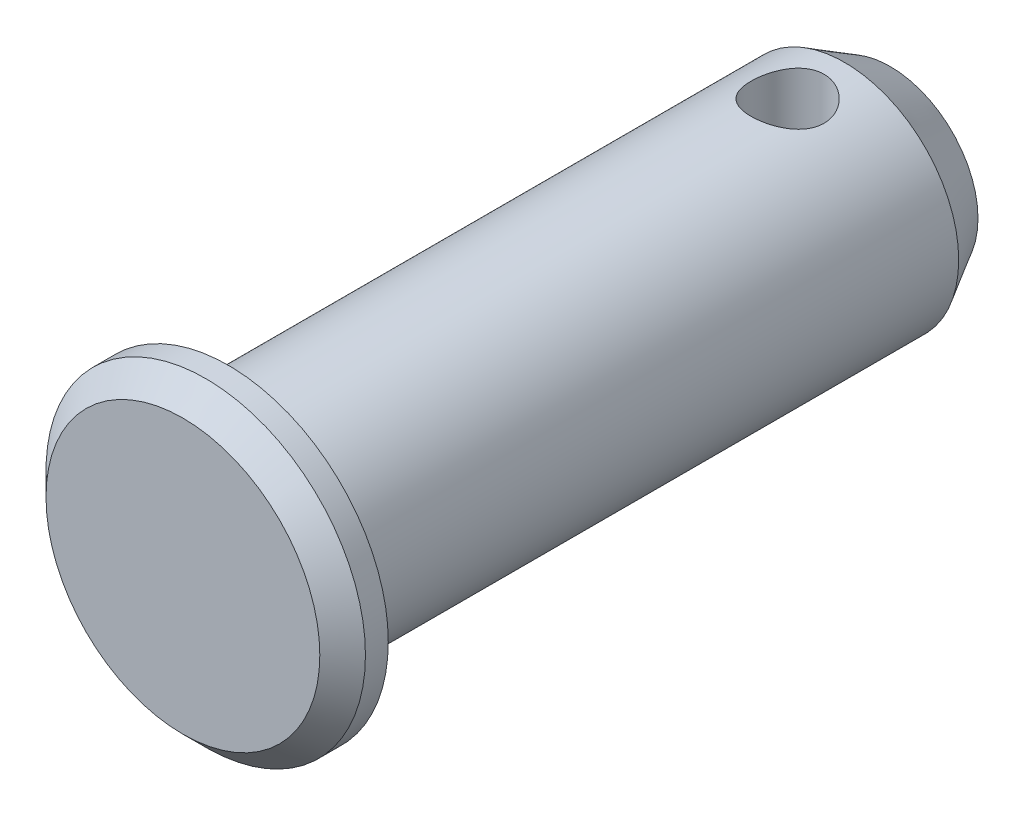
ISO-10303-21;
HEADER;
FILE_DESCRIPTION(('STEP AP214'),'2;1');
FILE_NAME('part.step','',(''),(''),'','','');
FILE_SCHEMA(('AUTOMOTIVE_DESIGN { 1 0 10303 214 1 1 1 1 }'));
ENDSEC;
DATA;
#1=APPLICATION_CONTEXT('core data for automotive mechanical design processes');
#2=APPLICATION_PROTOCOL_DEFINITION('international standard','automotive_design',2000,#1);
#3=PRODUCT_CONTEXT('',#1,'mechanical');
#4=PRODUCT('Part','Part','',(#3));
#5=PRODUCT_RELATED_PRODUCT_CATEGORY('part','',(#4));
#6=PRODUCT_DEFINITION_FORMATION('','',#4);
#7=PRODUCT_DEFINITION_CONTEXT('part definition',#1,'design');
#8=PRODUCT_DEFINITION('design','',#6,#7);
#9=PRODUCT_DEFINITION_SHAPE('','',#8);
#10=(LENGTH_UNIT() NAMED_UNIT(*) SI_UNIT(.MILLI.,.METRE.));
#11=(NAMED_UNIT(*) PLANE_ANGLE_UNIT() SI_UNIT($,.RADIAN.));
#12=(NAMED_UNIT(*) SI_UNIT($,.STERADIAN.) SOLID_ANGLE_UNIT());
#13=UNCERTAINTY_MEASURE_WITH_UNIT(LENGTH_MEASURE(1.E-05),#10,'distance_accuracy_value','');
#14=(GEOMETRIC_REPRESENTATION_CONTEXT(3) GLOBAL_UNCERTAINTY_ASSIGNED_CONTEXT((#13)) GLOBAL_UNIT_ASSIGNED_CONTEXT((#10,
#11,#12)) REPRESENTATION_CONTEXT('',''));
#15=CARTESIAN_POINT('',(0.,0.,0.));
#16=DIRECTION('',(0.,0.,1.));
#17=DIRECTION('',(1.,0.,0.));
#18=AXIS2_PLACEMENT_3D('',#15,#16,#17);
#19=CARTESIAN_POINT('',(0.,0.,15.5));
#20=DIRECTION('',(0.,0.,-1.));
#21=DIRECTION('',(-1.,0.,0.));
#22=AXIS2_PLACEMENT_3D('',#19,#20,#21);
#23=PLANE('',#22);
#24=CARTESIAN_POINT('',(0.,0.,15.5));
#25=DIRECTION('',(0.,0.,1.));
#26=DIRECTION('',(1.,0.,0.));
#27=AXIS2_PLACEMENT_3D('',#24,#25,#26);
#28=CIRCLE('',#27,6.);
#29=CARTESIAN_POINT('',(6.,0.,15.5));
#30=VERTEX_POINT('',#29);
#31=EDGE_CURVE('E10',#30,#30,#28,.T.);
#32=ORIENTED_EDGE('',*,*,#31,.T.);
#33=EDGE_LOOP('',(#32));
#34=FACE_BOUND('',#33,.T.);
#35=ADVANCED_FACE('F33',(#34),#23,.F.);
#36=CARTESIAN_POINT('',(0.,0.,14.5));
#37=DIRECTION('',(0.,0.,-1.));
#38=DIRECTION('',(-1.,0.,0.));
#39=AXIS2_PLACEMENT_3D('',#36,#37,#38);
#40=CONICAL_SURFACE('',#39,7.,0.785398163397447);
#41=ORIENTED_EDGE('',*,*,#31,.F.);
#42=EDGE_LOOP('',(#41));
#43=FACE_BOUND('',#42,.T.);
#44=CARTESIAN_POINT('',(0.,0.,14.5));
#45=DIRECTION('',(0.,0.,1.));
#46=DIRECTION('',(1.,0.,0.));
#47=AXIS2_PLACEMENT_3D('',#44,#45,#46);
#48=CIRCLE('',#47,7.);
#49=CARTESIAN_POINT('',(7.,0.,14.5));
#50=VERTEX_POINT('',#49);
#51=EDGE_CURVE('E45',#50,#50,#48,.T.);
#52=ORIENTED_EDGE('',*,*,#51,.T.);
#53=EDGE_LOOP('',(#52));
#54=FACE_BOUND('',#53,.T.);
#55=ADVANCED_FACE('F82',(#43,#54),#40,.T.);
#56=CARTESIAN_POINT('',(0.,0.,15.5));
#57=DIRECTION('',(0.,0.,1.));
#58=DIRECTION('',(1.,0.,0.));
#59=AXIS2_PLACEMENT_3D('',#56,#57,#58);
#60=CYLINDRICAL_SURFACE('',#59,7.);
#61=ORIENTED_EDGE('',*,*,#51,.F.);
#62=EDGE_LOOP('',(#61));
#63=FACE_BOUND('',#62,.T.);
#64=CARTESIAN_POINT('',(0.,0.,13.5));
#65=DIRECTION('',(0.,0.,1.));
#66=DIRECTION('',(1.,0.,0.));
#67=AXIS2_PLACEMENT_3D('',#64,#65,#66);
#68=CIRCLE('',#67,7.);
#69=CARTESIAN_POINT('',(7.,0.,13.5));
#70=VERTEX_POINT('',#69);
#71=EDGE_CURVE('E50',#70,#70,#68,.T.);
#72=ORIENTED_EDGE('',*,*,#71,.T.);
#73=EDGE_LOOP('',(#72));
#74=FACE_BOUND('',#73,.T.);
#75=ADVANCED_FACE('F86',(#63,#74),#60,.T.);
#76=CARTESIAN_POINT('',(0.,0.,13.5));
#77=DIRECTION('',(0.,0.,1.));
#78=DIRECTION('',(1.,0.,0.));
#79=AXIS2_PLACEMENT_3D('',#76,#77,#78);
#80=PLANE('',#79);
#81=ORIENTED_EDGE('',*,*,#71,.F.);
#82=EDGE_LOOP('',(#81));
#83=FACE_BOUND('',#82,.T.);
#84=CARTESIAN_POINT('',(0.,0.,13.5));
#85=DIRECTION('',(0.,0.,1.));
#86=DIRECTION('',(1.,0.,0.));
#87=AXIS2_PLACEMENT_3D('',#84,#85,#86);
#88=CIRCLE('',#87,5.);
#89=CARTESIAN_POINT('',(5.,0.,13.5));
#90=VERTEX_POINT('',#89);
#91=EDGE_CURVE('E103',#90,#90,#88,.T.);
#92=ORIENTED_EDGE('',*,*,#91,.T.);
#93=EDGE_LOOP('',(#92));
#94=FACE_BOUND('',#93,.T.);
#95=ADVANCED_FACE('F77',(#83,#94),#80,.F.);
#96=CARTESIAN_POINT('',(0.,0.,15.5));
#97=DIRECTION('',(0.,0.,1.));
#98=DIRECTION('',(1.,0.,0.));
#99=AXIS2_PLACEMENT_3D('',#96,#97,#98);
#100=CYLINDRICAL_SURFACE('',#99,5.);
#101=CARTESIAN_POINT('',(0.,-5.,-9.4));
#102=CARTESIAN_POINT('',(0.0874958063159797,-4.99999978543627,-9.40000024365058));
#103=CARTESIAN_POINT('',(0.174994637059061,-4.99768184156355,-9.40720059527926));
#104=CARTESIAN_POINT('',(0.347426901237483,-4.98866262172227,-9.43573181952926));
#105=CARTESIAN_POINT('',(0.432359863373708,-4.98196054553558,-9.45706527181791));
#106=CARTESIAN_POINT('',(0.597149225791566,-4.9649038363541,-9.51306492121177));
#107=CARTESIAN_POINT('',(0.677013473384596,-4.95455502045191,-9.5477098923706));
#108=CARTESIAN_POINT('',(0.829798762851158,-4.93126901642872,-9.62925683008726));
#109=CARTESIAN_POINT('',(0.902718607024946,-4.91833138300386,-9.67616090576561));
#110=CARTESIAN_POINT('',(1.04189475779498,-4.89077067933825,-9.78248411350403));
#111=CARTESIAN_POINT('',(1.1078960922464,-4.87610957732918,-9.84222709895342));
#112=CARTESIAN_POINT('',(1.22913423693228,-4.8469706570307,-9.97184306654741));
#113=CARTESIAN_POINT('',(1.28436891793797,-4.83249287552328,-10.0417180476549));
#114=CARTESIAN_POINT('',(1.38391395073831,-4.8049481079903,-10.1918528545104));
#115=CARTESIAN_POINT('',(1.42790123109944,-4.79192785635417,-10.2723362812705));
#116=CARTESIAN_POINT('',(1.5016091713459,-4.76934657798646,-10.4400423437701));
#117=CARTESIAN_POINT('',(1.53133379773326,-4.75978458968016,-10.5272630979883));
#118=CARTESIAN_POINT('',(1.57473134311321,-4.74560122760597,-10.7030826072729));
#119=CARTESIAN_POINT('',(1.58887896846386,-4.74083414932744,-10.791552101752));
#120=CARTESIAN_POINT('',(1.60220433058851,-4.73634831045,-10.9697275991845));
#121=CARTESIAN_POINT('',(1.6013862709372,-4.73662813227306,-11.059433247852));
#122=CARTESIAN_POINT('',(1.58517380736381,-4.74207619100075,-11.2335655848882));
#123=CARTESIAN_POINT('',(1.57038842132725,-4.7470401743042,-11.3180564534447));
#124=CARTESIAN_POINT('',(1.52765058974139,-4.76096457446162,-11.4832888444221));
#125=CARTESIAN_POINT('',(1.49969668269327,-4.76992543490025,-11.5640299495852));
#126=CARTESIAN_POINT('',(1.43099645158812,-4.7909865416364,-11.7208978588257));
#127=CARTESIAN_POINT('',(1.39006273103722,-4.80313229469362,-11.7969362199515));
#128=CARTESIAN_POINT('',(1.29669494334068,-4.82917444861168,-11.9412620430268));
#129=CARTESIAN_POINT('',(1.24425776827155,-4.8430713221454,-12.0095474027435));
#130=CARTESIAN_POINT('',(1.12640551540387,-4.87186372141871,-12.1398646728663));
#131=CARTESIAN_POINT('',(1.06048936249402,-4.8867752080818,-12.2014407769388));
#132=CARTESIAN_POINT('',(0.919081432217149,-4.91533168114877,-12.3127786782336));
#133=CARTESIAN_POINT('',(0.843588875652695,-4.92897656433707,-12.3625395131429));
#134=CARTESIAN_POINT('',(0.684261580712374,-4.95361789744584,-12.4491634432802));
#135=CARTESIAN_POINT('',(0.600361279440635,-4.96459080547942,-12.4859131008364));
#136=CARTESIAN_POINT('',(0.42713585036113,-4.98248161100196,-12.5446395966627));
#137=CARTESIAN_POINT('',(0.337812463131548,-4.98940080204637,-12.5666211478167));
#138=CARTESIAN_POINT('',(0.160141789589318,-4.99819424239135,-12.5944000666652));
#139=CARTESIAN_POINT('',(0.0719002860170735,-5.00026060178154,-12.6008140736111));
#140=CARTESIAN_POINT('',(-0.104410269588106,-4.99968655318444,-12.5990207817787));
#141=CARTESIAN_POINT('',(-0.19247934608744,-4.99704687004206,-12.5908157346901));
#142=CARTESIAN_POINT('',(-0.363535018203812,-4.98748380317497,-12.5605098869188));
#143=CARTESIAN_POINT('',(-0.446594362478023,-4.98067486649266,-12.5387800899141));
#144=CARTESIAN_POINT('',(-0.607861654600583,-4.96357585995349,-12.4824982006037));
#145=CARTESIAN_POINT('',(-0.686068993794125,-4.95328535439547,-12.4479445033978));
#146=CARTESIAN_POINT('',(-0.837596923870445,-4.92995531019905,-12.3660289828218));
#147=CARTESIAN_POINT('',(-0.910745620500966,-4.9168532627009,-12.3183674880577));
#148=CARTESIAN_POINT('',(-1.04821150300662,-4.8893940824048,-12.2119461270144));
#149=CARTESIAN_POINT('',(-1.11252617555398,-4.87503659432078,-12.1531831135417));
#150=CARTESIAN_POINT('',(-1.23328321488635,-4.84592967283237,-12.023325840389));
#151=CARTESIAN_POINT('',(-1.2892857947562,-4.83118884166735,-11.9518197323115));
#152=CARTESIAN_POINT('',(-1.38854141992569,-4.80360443110145,-11.8001053255418));
#153=CARTESIAN_POINT('',(-1.43179457025642,-4.79076083607138,-11.719897098546));
#154=CARTESIAN_POINT('',(-1.50407580301231,-4.76856262886575,-11.5531564213439));
#155=CARTESIAN_POINT('',(-1.53315066307446,-4.75919656820051,-11.4666458650103));
#156=CARTESIAN_POINT('',(-1.57620668246201,-4.74511281699328,-11.2895927901897));
#157=CARTESIAN_POINT('',(-1.59019395006567,-4.74039324536734,-11.199051918864));
#158=CARTESIAN_POINT('',(-1.60222535311566,-4.73633927898768,-11.021124030836));
#159=CARTESIAN_POINT('',(-1.60099388446006,-4.73676019091382,-10.933790988671));
#160=CARTESIAN_POINT('',(-1.5843835514937,-4.74234159093745,-10.7606429945653));
#161=CARTESIAN_POINT('',(-1.56900540861121,-4.74750183734632,-10.674827965439));
#162=CARTESIAN_POINT('',(-1.52503332416461,-4.76180543144416,-10.5085165746231));
#163=CARTESIAN_POINT('',(-1.49665627942706,-4.77088327236763,-10.4279568011071));
#164=CARTESIAN_POINT('',(-1.42766427484382,-4.79197975594362,-10.2726782395992));
#165=CARTESIAN_POINT('',(-1.38704674114626,-4.8039990169992,-10.1979606842373));
#166=CARTESIAN_POINT('',(-1.29279266707432,-4.83023494368376,-10.0531903701856));
#167=CARTESIAN_POINT('',(-1.23869308431578,-4.84452119052681,-9.98345173726595));
#168=CARTESIAN_POINT('',(-1.11981399792884,-4.87337180847354,-9.85380825417904));
#169=CARTESIAN_POINT('',(-1.05503158166823,-4.88793625446696,-9.79390609480135));
#170=CARTESIAN_POINT('',(-0.913912210298351,-4.91631108200117,-9.68354171407617));
#171=CARTESIAN_POINT('',(-0.83725135176078,-4.93007751880386,-9.63348104811569));
#172=CARTESIAN_POINT('',(-0.676163529926937,-4.95473787697861,-9.54701981190277));
#173=CARTESIAN_POINT('',(-0.591739263208157,-4.96563279071294,-9.5106145206792));
#174=CARTESIAN_POINT('',(-0.423663431644844,-4.98268341064065,-9.45475222016956));
#175=CARTESIAN_POINT('',(-0.34037676648733,-4.98911901301451,-9.43428154941689));
#176=CARTESIAN_POINT('',(-0.171394001076119,-4.99777693541394,-9.40690685709599));
#177=CARTESIAN_POINT('',(-0.0856984512613946,-5.00000021015613,-9.39999976135453));
#178=CARTESIAN_POINT('',(0.,-5.,-9.4));
#179=B_SPLINE_CURVE_WITH_KNOTS('',3,(#101,#102,#103,#104,#105,#106,#107,#108,#109,#110,#111,
#112,#113,#114,#115,#116,#117,#118,#119,#120,#121,#122,#123,#124,#125,#126,#127,#128,#129,#130,
#131,#132,#133,#134,#135,#136,#137,#138,#139,#140,#141,#142,#143,#144,#145,#146,#147,#148,#149,
#150,#151,#152,#153,#154,#155,#156,#157,#158,#159,#160,#161,#162,#163,#164,#165,#166,#167,#168,
#169,#170,#171,#172,#173,#174,#175,#176,#177,#178),.UNSPECIFIED.,.T.,.F.,(4,2,2,2,2,2,2,2,2,2,2,
2,2,2,2,2,2,2,2,2,2,2,2,2,2,2,2,2,2,2,2,2,2,2,2,2,2,2,4),(0.,0.262172289866488,
0.524392446348365,0.786196202111713,1.04804502964703,1.31749718151567,1.58700256668426,
1.86354828826627,2.14001705671955,2.40780489999506,2.67551752794224,2.93207089351446,
3.18865273918778,3.44912195934763,3.70966163813009,3.98267284808623,4.25570628624555,
4.53106471334195,4.80633522466349,5.07051010591344,5.33464430132699,5.59183416387789,
5.84905622438333,6.11273355055081,6.37648573964819,6.6512299305306,6.92597185797942,
7.19980110675104,7.47351945288796,7.73426134972847,7.99498995042988,8.25151822881316,
8.50810048600705,8.77513756675923,9.04224757485583,9.3186628553126,9.5949824844973,
9.85182740305347,10.1086141011961),.UNSPECIFIED.);
#180=CARTESIAN_POINT('',(0.,-5.,-9.4));
#181=VERTEX_POINT('',#180);
#182=EDGE_CURVE('E36',#181,#181,#179,.T.);
#183=ORIENTED_EDGE('',*,*,#182,.T.);
#184=EDGE_LOOP('',(#183));
#185=FACE_BOUND('',#184,.T.);
#186=CARTESIAN_POINT('',(0.,5.,-9.4));
#187=CARTESIAN_POINT('',(-0.0874958063159798,4.99999978543627,-9.40000024365058));
#188=CARTESIAN_POINT('',(-0.174994637059061,4.99768184156355,-9.40720059527926));
#189=CARTESIAN_POINT('',(-0.347426901237483,4.98866262172227,-9.43573181952926));
#190=CARTESIAN_POINT('',(-0.432359863373708,4.98196054553558,-9.45706527181791));
#191=CARTESIAN_POINT('',(-0.597149225791565,4.9649038363541,-9.51306492121177));
#192=CARTESIAN_POINT('',(-0.677013473384596,4.95455502045191,-9.5477098923706));
#193=CARTESIAN_POINT('',(-0.829798762851158,4.93126901642872,-9.62925683008726));
#194=CARTESIAN_POINT('',(-0.902718607024947,4.91833138300386,-9.67616090576561));
#195=CARTESIAN_POINT('',(-1.04189475779498,4.89077067933825,-9.78248411350403));
#196=CARTESIAN_POINT('',(-1.1078960922464,4.87610957732918,-9.84222709895342));
#197=CARTESIAN_POINT('',(-1.22913423693228,4.8469706570307,-9.97184306654741));
#198=CARTESIAN_POINT('',(-1.28436891793797,4.83249287552329,-10.0417180476549));
#199=CARTESIAN_POINT('',(-1.38391395073831,4.8049481079903,-10.1918528545104));
#200=CARTESIAN_POINT('',(-1.42790123109944,4.79192785635417,-10.2723362812705));
#201=CARTESIAN_POINT('',(-1.5016091713459,4.76934657798646,-10.4400423437701));
#202=CARTESIAN_POINT('',(-1.53133379773326,4.75978458968016,-10.5272630979883));
#203=CARTESIAN_POINT('',(-1.57473134311321,4.74560122760597,-10.7030826072729));
#204=CARTESIAN_POINT('',(-1.58887896846386,4.74083414932745,-10.791552101752));
#205=CARTESIAN_POINT('',(-1.60220433058851,4.73634831045,-10.9697275991845));
#206=CARTESIAN_POINT('',(-1.6013862709372,4.73662813227306,-11.059433247852));
#207=CARTESIAN_POINT('',(-1.58517380736381,4.74207619100075,-11.2335655848882));
#208=CARTESIAN_POINT('',(-1.57038842132725,4.7470401743042,-11.3180564534447));
#209=CARTESIAN_POINT('',(-1.52765058974139,4.76096457446162,-11.4832888444221));
#210=CARTESIAN_POINT('',(-1.49969668269327,4.76992543490025,-11.5640299495852));
#211=CARTESIAN_POINT('',(-1.43099645158812,4.7909865416364,-11.7208978588257));
#212=CARTESIAN_POINT('',(-1.39006273103722,4.80313229469363,-11.7969362199515));
#213=CARTESIAN_POINT('',(-1.29669494334068,4.82917444861168,-11.9412620430268));
#214=CARTESIAN_POINT('',(-1.24425776827155,4.84307132214541,-12.0095474027435));
#215=CARTESIAN_POINT('',(-1.12640551540387,4.87186372141871,-12.1398646728663));
#216=CARTESIAN_POINT('',(-1.06048936249402,4.8867752080818,-12.2014407769388));
#217=CARTESIAN_POINT('',(-0.919081432217149,4.91533168114877,-12.3127786782336));
#218=CARTESIAN_POINT('',(-0.843588875652695,4.92897656433707,-12.3625395131429));
#219=CARTESIAN_POINT('',(-0.684261580712374,4.95361789744584,-12.4491634432802));
#220=CARTESIAN_POINT('',(-0.600361279440635,4.96459080547942,-12.4859131008364));
#221=CARTESIAN_POINT('',(-0.42713585036113,4.98248161100197,-12.5446395966627));
#222=CARTESIAN_POINT('',(-0.337812463131548,4.98940080204637,-12.5666211478167));
#223=CARTESIAN_POINT('',(-0.160141789589317,4.99819424239135,-12.5944000666652));
#224=CARTESIAN_POINT('',(-0.0719002860170728,5.00026060178154,-12.6008140736111));
#225=CARTESIAN_POINT('',(0.104410269588107,4.99968655318444,-12.5990207817787));
#226=CARTESIAN_POINT('',(0.19247934608744,4.99704687004206,-12.5908157346901));
#227=CARTESIAN_POINT('',(0.363535018203813,4.98748380317497,-12.5605098869188));
#228=CARTESIAN_POINT('',(0.446594362478024,4.98067486649266,-12.5387800899141));
#229=CARTESIAN_POINT('',(0.607861654600583,4.96357585995349,-12.4824982006037));
#230=CARTESIAN_POINT('',(0.686068993794126,4.95328535439547,-12.4479445033978));
#231=CARTESIAN_POINT('',(0.837596923870446,4.92995531019905,-12.3660289828218));
#232=CARTESIAN_POINT('',(0.910745620500968,4.9168532627009,-12.3183674880577));
#233=CARTESIAN_POINT('',(1.04821150300662,4.8893940824048,-12.2119461270144));
#234=CARTESIAN_POINT('',(1.11252617555398,4.87503659432078,-12.1531831135417));
#235=CARTESIAN_POINT('',(1.23328321488635,4.84592967283237,-12.023325840389));
#236=CARTESIAN_POINT('',(1.2892857947562,4.83118884166735,-11.9518197323115));
#237=CARTESIAN_POINT('',(1.38854141992569,4.80360443110145,-11.8001053255418));
#238=CARTESIAN_POINT('',(1.43179457025642,4.79076083607138,-11.719897098546));
#239=CARTESIAN_POINT('',(1.50407580301232,4.76856262886575,-11.5531564213439));
#240=CARTESIAN_POINT('',(1.53315066307446,4.75919656820051,-11.4666458650103));
#241=CARTESIAN_POINT('',(1.57620668246201,4.74511281699328,-11.2895927901897));
#242=CARTESIAN_POINT('',(1.59019395006567,4.74039324536734,-11.199051918864));
#243=CARTESIAN_POINT('',(1.60222535311566,4.73633927898768,-11.021124030836));
#244=CARTESIAN_POINT('',(1.60099388446006,4.73676019091382,-10.933790988671));
#245=CARTESIAN_POINT('',(1.5843835514937,4.74234159093745,-10.7606429945653));
#246=CARTESIAN_POINT('',(1.56900540861121,4.74750183734632,-10.674827965439));
#247=CARTESIAN_POINT('',(1.52503332416461,4.76180543144416,-10.5085165746231));
#248=CARTESIAN_POINT('',(1.49665627942706,4.77088327236763,-10.4279568011071));
#249=CARTESIAN_POINT('',(1.42766427484382,4.79197975594362,-10.2726782395992));
#250=CARTESIAN_POINT('',(1.38704674114626,4.8039990169992,-10.1979606842373));
#251=CARTESIAN_POINT('',(1.29279266707432,4.83023494368376,-10.0531903701856));
#252=CARTESIAN_POINT('',(1.23869308431579,4.8445211905268,-9.98345173726596));
#253=CARTESIAN_POINT('',(1.11981399792885,4.87337180847353,-9.85380825417904));
#254=CARTESIAN_POINT('',(1.05503158166823,4.88793625446696,-9.79390609480135));
#255=CARTESIAN_POINT('',(0.913912210298352,4.91631108200117,-9.68354171407617));
#256=CARTESIAN_POINT('',(0.837251351760781,4.93007751880386,-9.63348104811569));
#257=CARTESIAN_POINT('',(0.676163529926938,4.95473787697861,-9.54701981190277));
#258=CARTESIAN_POINT('',(0.591739263208158,4.96563279071294,-9.5106145206792));
#259=CARTESIAN_POINT('',(0.423663431644846,4.98268341064065,-9.45475222016956));
#260=CARTESIAN_POINT('',(0.340376766487331,4.98911901301451,-9.43428154941689));
#261=CARTESIAN_POINT('',(0.17139400107612,4.99777693541394,-9.40690685709599));
#262=CARTESIAN_POINT('',(0.085698451261395,5.00000021015613,-9.39999976135453));
#263=CARTESIAN_POINT('',(0.,5.,-9.4));
#264=B_SPLINE_CURVE_WITH_KNOTS('',3,(#186,#187,#188,#189,#190,#191,#192,#193,#194,#195,#196,
#197,#198,#199,#200,#201,#202,#203,#204,#205,#206,#207,#208,#209,#210,#211,#212,#213,#214,#215,
#216,#217,#218,#219,#220,#221,#222,#223,#224,#225,#226,#227,#228,#229,#230,#231,#232,#233,#234,
#235,#236,#237,#238,#239,#240,#241,#242,#243,#244,#245,#246,#247,#248,#249,#250,#251,#252,#253,
#254,#255,#256,#257,#258,#259,#260,#261,#262,#263),.UNSPECIFIED.,.T.,.F.,(4,2,2,2,2,2,2,2,2,2,2,
2,2,2,2,2,2,2,2,2,2,2,2,2,2,2,2,2,2,2,2,2,2,2,2,2,2,2,4),(0.,0.262172289866488,
0.524392446348365,0.786196202111712,1.04804502964703,1.31749718151567,1.58700256668426,
1.86354828826627,2.14001705671955,2.40780489999506,2.67551752794224,2.93207089351446,
3.18865273918778,3.44912195934763,3.70966163813009,3.98267284808623,4.25570628624555,
4.53106471334195,4.80633522466348,5.07051010591344,5.33464430132699,5.59183416387789,
5.84905622438333,6.11273355055081,6.37648573964819,6.6512299305306,6.92597185797942,
7.19980110675105,7.47351945288796,7.73426134972847,7.99498995042988,8.25151822881316,
8.50810048600705,8.77513756675922,9.04224757485583,9.3186628553126,9.5949824844973,
9.85182740305347,10.1086141011961),.UNSPECIFIED.);
#265=CARTESIAN_POINT('',(0.,5.,-9.4));
#266=VERTEX_POINT('',#265);
#267=EDGE_CURVE('E53',#266,#266,#264,.T.);
#268=ORIENTED_EDGE('',*,*,#267,.T.);
#269=EDGE_LOOP('',(#268));
#270=FACE_BOUND('',#269,.T.);
#271=ORIENTED_EDGE('',*,*,#91,.F.);
#272=EDGE_LOOP('',(#271));
#273=FACE_BOUND('',#272,.T.);
#274=CARTESIAN_POINT('',(0.,0.,-13.5));
#275=DIRECTION('',(0.,0.,1.));
#276=DIRECTION('',(1.,0.,0.));
#277=AXIS2_PLACEMENT_3D('',#274,#275,#276);
#278=CIRCLE('',#277,5.);
#279=CARTESIAN_POINT('',(5.,0.,-13.5));
#280=VERTEX_POINT('',#279);
#281=EDGE_CURVE('E105',#280,#280,#278,.T.);
#282=ORIENTED_EDGE('',*,*,#281,.T.);
#283=EDGE_LOOP('',(#282));
#284=FACE_BOUND('',#283,.T.);
#285=ADVANCED_FACE('F58',(#185,#270,#273,#284),#100,.T.);
#286=CARTESIAN_POINT('',(0.,0.,-15.5));
#287=DIRECTION('',(0.,0.,1.));
#288=DIRECTION('',(1.,0.,0.));
#289=AXIS2_PLACEMENT_3D('',#286,#287,#288);
#290=CONICAL_SURFACE('',#289,3.84529946162075,0.523598775598298);
#291=ORIENTED_EDGE('',*,*,#281,.F.);
#292=EDGE_LOOP('',(#291));
#293=FACE_BOUND('',#292,.T.);
#294=CARTESIAN_POINT('',(0.,0.,-15.5));
#295=DIRECTION('',(0.,0.,1.));
#296=DIRECTION('',(1.,0.,0.));
#297=AXIS2_PLACEMENT_3D('',#294,#295,#296);
#298=CIRCLE('',#297,3.84529946162075);
#299=CARTESIAN_POINT('',(3.84529946162075,0.,-15.5));
#300=VERTEX_POINT('',#299);
#301=EDGE_CURVE('E108',#300,#300,#298,.T.);
#302=ORIENTED_EDGE('',*,*,#301,.T.);
#303=EDGE_LOOP('',(#302));
#304=FACE_BOUND('',#303,.T.);
#305=ADVANCED_FACE('F70',(#293,#304),#290,.T.);
#306=CARTESIAN_POINT('',(0.,0.,-15.5));
#307=DIRECTION('',(0.,0.,1.));
#308=DIRECTION('',(1.,0.,0.));
#309=AXIS2_PLACEMENT_3D('',#306,#307,#308);
#310=PLANE('',#309);
#311=ORIENTED_EDGE('',*,*,#301,.F.);
#312=EDGE_LOOP('',(#311));
#313=FACE_BOUND('',#312,.T.);
#314=ADVANCED_FACE('F66',(#313),#310,.F.);
#315=CARTESIAN_POINT('',(0.,-7.,-11.));
#316=DIRECTION('',(0.,1.,0.));
#317=DIRECTION('',(0.,0.,1.));
#318=AXIS2_PLACEMENT_3D('',#315,#316,#317);
#319=CYLINDRICAL_SURFACE('',#318,1.6);
#320=ORIENTED_EDGE('',*,*,#267,.F.);
#321=EDGE_LOOP('',(#320));
#322=FACE_BOUND('',#321,.T.);
#323=ORIENTED_EDGE('',*,*,#182,.F.);
#324=EDGE_LOOP('',(#323));
#325=FACE_BOUND('',#324,.T.);
#326=ADVANCED_FACE('F62',(#322,#325),#319,.F.);
#327=CLOSED_SHELL('',(#35,#55,#75,#95,#285,#305,#314,#326));
#328=MANIFOLD_SOLID_BREP('B2',#327);
#329=ADVANCED_BREP_SHAPE_REPRESENTATION('',(#18,#328),#14);
#330=SHAPE_DEFINITION_REPRESENTATION(#9,#329);
ENDSEC;
END-ISO-10303-21;
